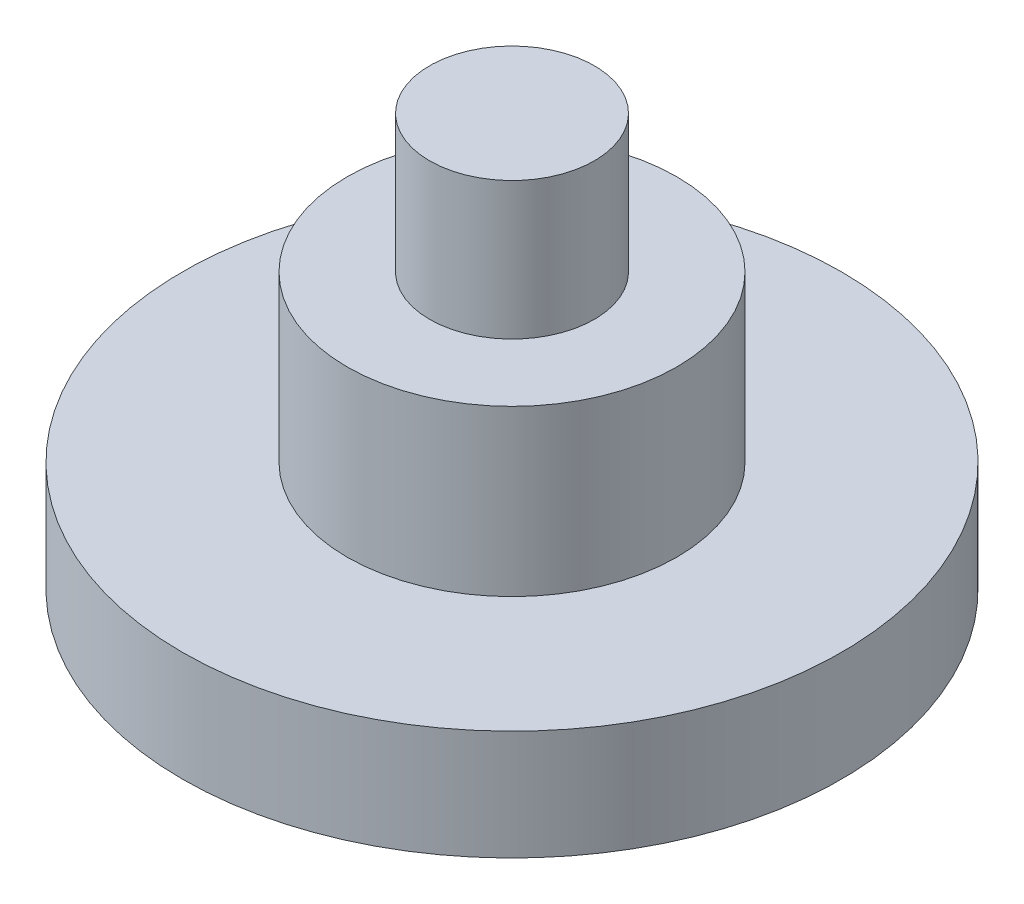
ISO-10303-21;
HEADER;
FILE_DESCRIPTION(('STEP AP214'),'2;1');
FILE_NAME('part.step','',(''),(''),'','','');
FILE_SCHEMA(('AUTOMOTIVE_DESIGN { 1 0 10303 214 1 1 1 1 }'));
ENDSEC;
DATA;
#1=APPLICATION_CONTEXT('core data for automotive mechanical design processes');
#2=APPLICATION_PROTOCOL_DEFINITION('international standard','automotive_design',2000,#1);
#3=PRODUCT_CONTEXT('',#1,'mechanical');
#4=PRODUCT('Part','Part','',(#3));
#5=PRODUCT_RELATED_PRODUCT_CATEGORY('part','',(#4));
#6=PRODUCT_DEFINITION_FORMATION('','',#4);
#7=PRODUCT_DEFINITION_CONTEXT('part definition',#1,'design');
#8=PRODUCT_DEFINITION('design','',#6,#7);
#9=PRODUCT_DEFINITION_SHAPE('','',#8);
#10=(LENGTH_UNIT() NAMED_UNIT(*) SI_UNIT(.MILLI.,.METRE.));
#11=(NAMED_UNIT(*) PLANE_ANGLE_UNIT() SI_UNIT($,.RADIAN.));
#12=(NAMED_UNIT(*) SI_UNIT($,.STERADIAN.) SOLID_ANGLE_UNIT());
#13=UNCERTAINTY_MEASURE_WITH_UNIT(LENGTH_MEASURE(1.E-05),#10,'distance_accuracy_value','');
#14=(GEOMETRIC_REPRESENTATION_CONTEXT(3) GLOBAL_UNCERTAINTY_ASSIGNED_CONTEXT((#13)) GLOBAL_UNIT_ASSIGNED_CONTEXT((#10,
#11,#12)) REPRESENTATION_CONTEXT('',''));
#15=CARTESIAN_POINT('',(0.,0.,0.));
#16=DIRECTION('',(0.,0.,1.));
#17=DIRECTION('',(1.,0.,0.));
#18=AXIS2_PLACEMENT_3D('',#15,#16,#17);
#19=CARTESIAN_POINT('',(0.,20.,0.));
#20=DIRECTION('',(0.,-1.,0.));
#21=DIRECTION('',(0.,0.,-1.));
#22=AXIS2_PLACEMENT_3D('',#19,#20,#21);
#23=CYLINDRICAL_SURFACE('',#22,60.);
#24=CARTESIAN_POINT('',(0.,20.,0.));
#25=DIRECTION('',(0.,1.,0.));
#26=DIRECTION('',(0.,0.,1.));
#27=AXIS2_PLACEMENT_3D('',#24,#25,#26);
#28=CIRCLE('',#27,60.);
#29=CARTESIAN_POINT('',(0.,20.,60.));
#30=VERTEX_POINT('',#29);
#31=EDGE_CURVE('E47',#30,#30,#28,.T.);
#32=ORIENTED_EDGE('',*,*,#31,.F.);
#33=EDGE_LOOP('',(#32));
#34=FACE_BOUND('',#33,.T.);
#35=CARTESIAN_POINT('',(0.,0.,0.));
#36=DIRECTION('',(0.,1.,0.));
#37=DIRECTION('',(0.,0.,1.));
#38=AXIS2_PLACEMENT_3D('',#35,#36,#37);
#39=CIRCLE('',#38,60.);
#40=CARTESIAN_POINT('',(0.,0.,60.));
#41=VERTEX_POINT('',#40);
#42=EDGE_CURVE('E37',#41,#41,#39,.T.);
#43=ORIENTED_EDGE('',*,*,#42,.T.);
#44=EDGE_LOOP('',(#43));
#45=FACE_BOUND('',#44,.T.);
#46=ADVANCED_FACE('F40',(#34,#45),#23,.T.);
#47=CARTESIAN_POINT('',(0.,20.,0.));
#48=DIRECTION('',(0.,1.,0.));
#49=DIRECTION('',(0.,0.,1.));
#50=AXIS2_PLACEMENT_3D('',#47,#48,#49);
#51=PLANE('',#50);
#52=CARTESIAN_POINT('',(0.,20.,0.));
#53=DIRECTION('',(0.,1.,0.));
#54=DIRECTION('',(0.,0.,1.));
#55=AXIS2_PLACEMENT_3D('',#52,#53,#54);
#56=CIRCLE('',#55,30.);
#57=CARTESIAN_POINT('',(0.,20.,30.));
#58=VERTEX_POINT('',#57);
#59=EDGE_CURVE('E42',#58,#58,#56,.T.);
#60=ORIENTED_EDGE('',*,*,#59,.F.);
#61=EDGE_LOOP('',(#60));
#62=FACE_BOUND('',#61,.T.);
#63=ORIENTED_EDGE('',*,*,#31,.T.);
#64=EDGE_LOOP('',(#63));
#65=FACE_BOUND('',#64,.T.);
#66=ADVANCED_FACE('F67',(#62,#65),#51,.T.);
#67=CARTESIAN_POINT('',(0.,0.,0.));
#68=DIRECTION('',(0.,1.,0.));
#69=DIRECTION('',(0.,0.,1.));
#70=AXIS2_PLACEMENT_3D('',#67,#68,#69);
#71=PLANE('',#70);
#72=ORIENTED_EDGE('',*,*,#42,.F.);
#73=EDGE_LOOP('',(#72));
#74=FACE_BOUND('',#73,.T.);
#75=ADVANCED_FACE('F64',(#74),#71,.F.);
#76=CARTESIAN_POINT('',(0.,50.,0.));
#77=DIRECTION('',(0.,-1.,0.));
#78=DIRECTION('',(0.,0.,-1.));
#79=AXIS2_PLACEMENT_3D('',#76,#77,#78);
#80=CYLINDRICAL_SURFACE('',#79,30.);
#81=CARTESIAN_POINT('',(0.,50.,0.));
#82=DIRECTION('',(0.,1.,0.));
#83=DIRECTION('',(0.,0.,1.));
#84=AXIS2_PLACEMENT_3D('',#81,#82,#83);
#85=CIRCLE('',#84,30.);
#86=CARTESIAN_POINT('',(0.,50.,30.));
#87=VERTEX_POINT('',#86);
#88=EDGE_CURVE('E53',#87,#87,#85,.T.);
#89=ORIENTED_EDGE('',*,*,#88,.F.);
#90=EDGE_LOOP('',(#89));
#91=FACE_BOUND('',#90,.T.);
#92=ORIENTED_EDGE('',*,*,#59,.T.);
#93=EDGE_LOOP('',(#92));
#94=FACE_BOUND('',#93,.T.);
#95=ADVANCED_FACE('F63',(#91,#94),#80,.T.);
#96=CARTESIAN_POINT('',(0.,50.,0.));
#97=DIRECTION('',(0.,1.,0.));
#98=DIRECTION('',(0.,0.,1.));
#99=AXIS2_PLACEMENT_3D('',#96,#97,#98);
#100=PLANE('',#99);
#101=CARTESIAN_POINT('',(0.,50.,0.));
#102=DIRECTION('',(0.,1.,0.));
#103=DIRECTION('',(0.,0.,1.));
#104=AXIS2_PLACEMENT_3D('',#101,#102,#103);
#105=CIRCLE('',#104,15.);
#106=CARTESIAN_POINT('',(0.,50.,15.));
#107=VERTEX_POINT('',#106);
#108=EDGE_CURVE('E10',#107,#107,#105,.T.);
#109=ORIENTED_EDGE('',*,*,#108,.F.);
#110=EDGE_LOOP('',(#109));
#111=FACE_BOUND('',#110,.T.);
#112=ORIENTED_EDGE('',*,*,#88,.T.);
#113=EDGE_LOOP('',(#112));
#114=FACE_BOUND('',#113,.T.);
#115=ADVANCED_FACE('F75',(#111,#114),#100,.T.);
#116=CARTESIAN_POINT('',(0.,75.,0.));
#117=DIRECTION('',(0.,-1.,0.));
#118=DIRECTION('',(0.,0.,-1.));
#119=AXIS2_PLACEMENT_3D('',#116,#117,#118);
#120=CYLINDRICAL_SURFACE('',#119,15.);
#121=CARTESIAN_POINT('',(0.,75.,0.));
#122=DIRECTION('',(0.,1.,0.));
#123=DIRECTION('',(0.,0.,1.));
#124=AXIS2_PLACEMENT_3D('',#121,#122,#123);
#125=CIRCLE('',#124,15.);
#126=CARTESIAN_POINT('',(0.,75.,15.));
#127=VERTEX_POINT('',#126);
#128=EDGE_CURVE('E52',#127,#127,#125,.T.);
#129=ORIENTED_EDGE('',*,*,#128,.F.);
#130=EDGE_LOOP('',(#129));
#131=FACE_BOUND('',#130,.T.);
#132=ORIENTED_EDGE('',*,*,#108,.T.);
#133=EDGE_LOOP('',(#132));
#134=FACE_BOUND('',#133,.T.);
#135=ADVANCED_FACE('F106',(#131,#134),#120,.T.);
#136=CARTESIAN_POINT('',(0.,75.,0.));
#137=DIRECTION('',(0.,1.,0.));
#138=DIRECTION('',(0.,0.,1.));
#139=AXIS2_PLACEMENT_3D('',#136,#137,#138);
#140=PLANE('',#139);
#141=ORIENTED_EDGE('',*,*,#128,.T.);
#142=EDGE_LOOP('',(#141));
#143=FACE_BOUND('',#142,.T.);
#144=ADVANCED_FACE('F117',(#143),#140,.T.);
#145=CLOSED_SHELL('',(#46,#66,#75,#95,#115,#135,#144));
#146=MANIFOLD_SOLID_BREP('B2',#145);
#147=ADVANCED_BREP_SHAPE_REPRESENTATION('',(#18,#146),#14);
#148=SHAPE_DEFINITION_REPRESENTATION(#9,#147);
ENDSEC;
END-ISO-10303-21;
